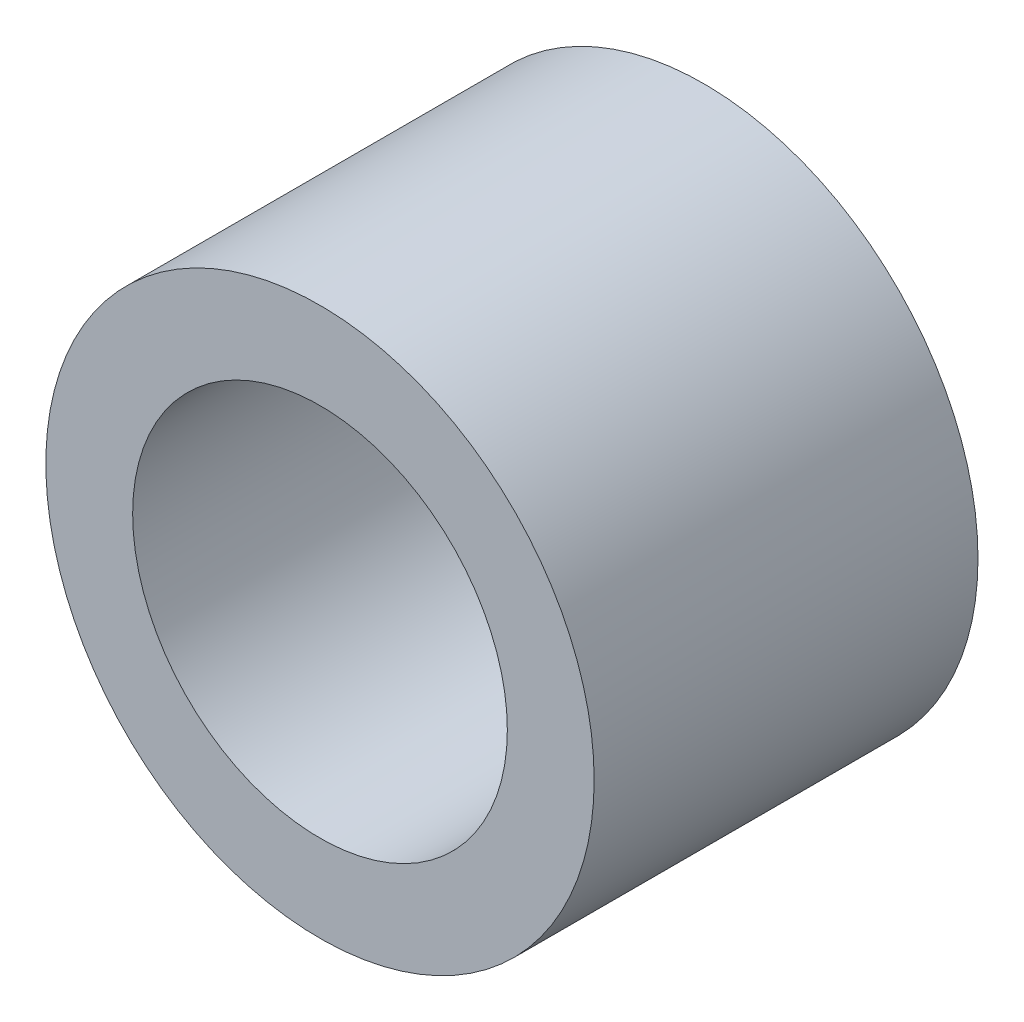
ISO-10303-21;
HEADER;
FILE_DESCRIPTION(('STEP AP214'),'2;1');
FILE_NAME('part.step','',(''),(''),'','','');
FILE_SCHEMA(('AUTOMOTIVE_DESIGN { 1 0 10303 214 1 1 1 1 }'));
ENDSEC;
DATA;
#1=APPLICATION_CONTEXT('core data for automotive mechanical design processes');
#2=APPLICATION_PROTOCOL_DEFINITION('international standard','automotive_design',2000,#1);
#3=PRODUCT_CONTEXT('',#1,'mechanical');
#4=PRODUCT('Part','Part','',(#3));
#5=PRODUCT_RELATED_PRODUCT_CATEGORY('part','',(#4));
#6=PRODUCT_DEFINITION_FORMATION('','',#4);
#7=PRODUCT_DEFINITION_CONTEXT('part definition',#1,'design');
#8=PRODUCT_DEFINITION('design','',#6,#7);
#9=PRODUCT_DEFINITION_SHAPE('','',#8);
#10=(LENGTH_UNIT() NAMED_UNIT(*) SI_UNIT(.MILLI.,.METRE.));
#11=(NAMED_UNIT(*) PLANE_ANGLE_UNIT() SI_UNIT($,.RADIAN.));
#12=(NAMED_UNIT(*) SI_UNIT($,.STERADIAN.) SOLID_ANGLE_UNIT());
#13=UNCERTAINTY_MEASURE_WITH_UNIT(LENGTH_MEASURE(1.E-05),#10,'distance_accuracy_value','');
#14=(GEOMETRIC_REPRESENTATION_CONTEXT(3) GLOBAL_UNCERTAINTY_ASSIGNED_CONTEXT((#13)) GLOBAL_UNIT_ASSIGNED_CONTEXT((#10,
#11,#12)) REPRESENTATION_CONTEXT('',''));
#15=CARTESIAN_POINT('',(0.,0.,0.));
#16=DIRECTION('',(0.,0.,1.));
#17=DIRECTION('',(1.,0.,0.));
#18=AXIS2_PLACEMENT_3D('',#15,#16,#17);
#19=CARTESIAN_POINT('',(0.,0.,4.2));
#20=DIRECTION('',(0.,0.,1.));
#21=DIRECTION('',(1.,0.,0.));
#22=AXIS2_PLACEMENT_3D('',#19,#20,#21);
#23=PLANE('',#22);
#24=CARTESIAN_POINT('',(0.,0.,4.2));
#25=DIRECTION('',(0.,0.,1.));
#26=DIRECTION('',(1.,0.,0.));
#27=AXIS2_PLACEMENT_3D('',#24,#25,#26);
#28=CIRCLE('',#27,3.);
#29=CARTESIAN_POINT('',(3.,0.,4.2));
#30=VERTEX_POINT('',#29);
#31=EDGE_CURVE('E10',#30,#30,#28,.T.);
#32=ORIENTED_EDGE('',*,*,#31,.T.);
#33=EDGE_LOOP('',(#32));
#34=FACE_BOUND('',#33,.T.);
#35=CARTESIAN_POINT('',(0.,0.,4.2));
#36=DIRECTION('',(0.,0.,1.));
#37=DIRECTION('',(1.,0.,0.));
#38=AXIS2_PLACEMENT_3D('',#35,#36,#37);
#39=CIRCLE('',#38,2.05);
#40=CARTESIAN_POINT('',(2.05,0.,4.2));
#41=VERTEX_POINT('',#40);
#42=EDGE_CURVE('E48',#41,#41,#39,.T.);
#43=ORIENTED_EDGE('',*,*,#42,.F.);
#44=EDGE_LOOP('',(#43));
#45=FACE_BOUND('',#44,.T.);
#46=ADVANCED_FACE('F40',(#34,#45),#23,.T.);
#47=CARTESIAN_POINT('',(0.,0.,0.));
#48=DIRECTION('',(0.,0.,1.));
#49=DIRECTION('',(1.,0.,0.));
#50=AXIS2_PLACEMENT_3D('',#47,#48,#49);
#51=PLANE('',#50);
#52=CARTESIAN_POINT('',(0.,0.,0.));
#53=DIRECTION('',(0.,0.,1.));
#54=DIRECTION('',(1.,0.,0.));
#55=AXIS2_PLACEMENT_3D('',#52,#53,#54);
#56=CIRCLE('',#55,3.);
#57=CARTESIAN_POINT('',(3.,0.,0.));
#58=VERTEX_POINT('',#57);
#59=EDGE_CURVE('E41',#58,#58,#56,.T.);
#60=ORIENTED_EDGE('',*,*,#59,.F.);
#61=EDGE_LOOP('',(#60));
#62=FACE_BOUND('',#61,.T.);
#63=CARTESIAN_POINT('',(0.,0.,0.));
#64=DIRECTION('',(0.,0.,1.));
#65=DIRECTION('',(1.,0.,0.));
#66=AXIS2_PLACEMENT_3D('',#63,#64,#65);
#67=CIRCLE('',#66,2.05);
#68=CARTESIAN_POINT('',(2.05,0.,0.));
#69=VERTEX_POINT('',#68);
#70=EDGE_CURVE('E49',#69,#69,#67,.T.);
#71=ORIENTED_EDGE('',*,*,#70,.T.);
#72=EDGE_LOOP('',(#71));
#73=FACE_BOUND('',#72,.T.);
#74=ADVANCED_FACE('F58',(#62,#73),#51,.F.);
#75=CARTESIAN_POINT('',(0.,0.,4.2));
#76=DIRECTION('',(0.,0.,-1.));
#77=DIRECTION('',(-1.,0.,0.));
#78=AXIS2_PLACEMENT_3D('',#75,#76,#77);
#79=CYLINDRICAL_SURFACE('',#78,3.);
#80=ORIENTED_EDGE('',*,*,#31,.F.);
#81=EDGE_LOOP('',(#80));
#82=FACE_BOUND('',#81,.T.);
#83=ORIENTED_EDGE('',*,*,#59,.T.);
#84=EDGE_LOOP('',(#83));
#85=FACE_BOUND('',#84,.T.);
#86=ADVANCED_FACE('F39',(#82,#85),#79,.T.);
#87=CARTESIAN_POINT('',(0.,0.,4.2));
#88=DIRECTION('',(0.,0.,-1.));
#89=DIRECTION('',(-1.,0.,0.));
#90=AXIS2_PLACEMENT_3D('',#87,#88,#89);
#91=CYLINDRICAL_SURFACE('',#90,2.05);
#92=ORIENTED_EDGE('',*,*,#42,.T.);
#93=EDGE_LOOP('',(#92));
#94=FACE_BOUND('',#93,.T.);
#95=ORIENTED_EDGE('',*,*,#70,.F.);
#96=EDGE_LOOP('',(#95));
#97=FACE_BOUND('',#96,.T.);
#98=ADVANCED_FACE('F57',(#94,#97),#91,.F.);
#99=CLOSED_SHELL('',(#46,#74,#86,#98));
#100=MANIFOLD_SOLID_BREP('B2',#99);
#101=ADVANCED_BREP_SHAPE_REPRESENTATION('',(#18,#100),#14);
#102=SHAPE_DEFINITION_REPRESENTATION(#9,#101);
ENDSEC;
END-ISO-10303-21;
